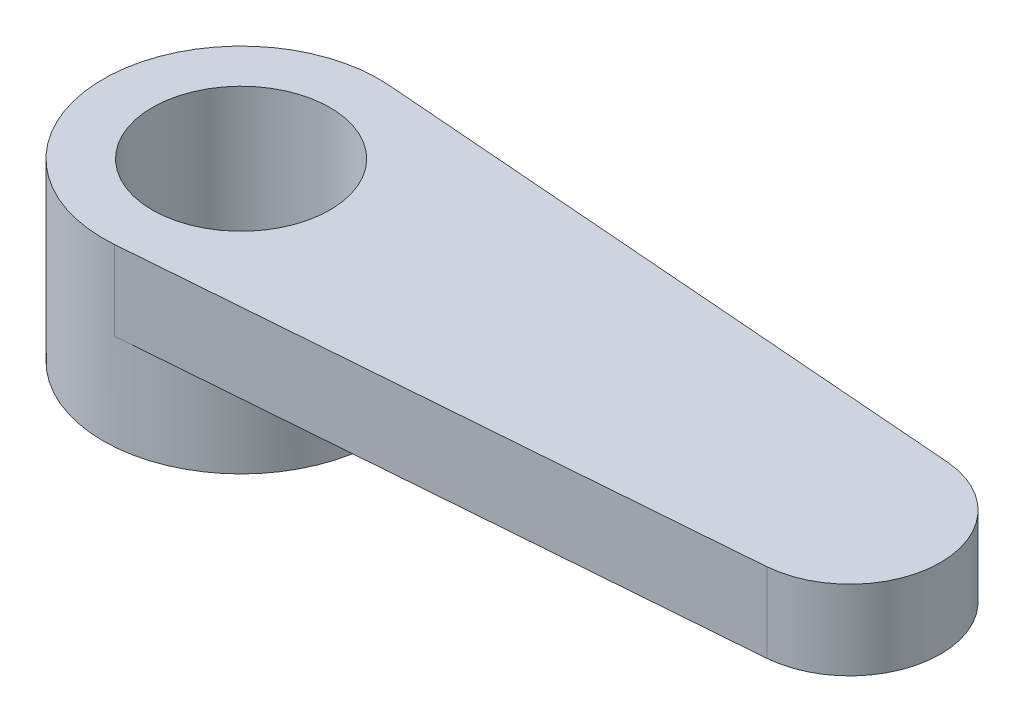
ISO-10303-21;
HEADER;
FILE_DESCRIPTION(('STEP AP214'),'2;1');
FILE_NAME('part.step','',(''),(''),'','','');
FILE_SCHEMA(('AUTOMOTIVE_DESIGN { 1 0 10303 214 1 1 1 1 }'));
ENDSEC;
DATA;
#1=APPLICATION_CONTEXT('core data for automotive mechanical design processes');
#2=APPLICATION_PROTOCOL_DEFINITION('international standard','automotive_design',2000,#1);
#3=PRODUCT_CONTEXT('',#1,'mechanical');
#4=PRODUCT('Part','Part','',(#3));
#5=PRODUCT_RELATED_PRODUCT_CATEGORY('part','',(#4));
#6=PRODUCT_DEFINITION_FORMATION('','',#4);
#7=PRODUCT_DEFINITION_CONTEXT('part definition',#1,'design');
#8=PRODUCT_DEFINITION('design','',#6,#7);
#9=PRODUCT_DEFINITION_SHAPE('','',#8);
#10=(LENGTH_UNIT() NAMED_UNIT(*) SI_UNIT(.MILLI.,.METRE.));
#11=(NAMED_UNIT(*) PLANE_ANGLE_UNIT() SI_UNIT($,.RADIAN.));
#12=(NAMED_UNIT(*) SI_UNIT($,.STERADIAN.) SOLID_ANGLE_UNIT());
#13=UNCERTAINTY_MEASURE_WITH_UNIT(LENGTH_MEASURE(1.E-05),#10,'distance_accuracy_value','');
#14=(GEOMETRIC_REPRESENTATION_CONTEXT(3) GLOBAL_UNCERTAINTY_ASSIGNED_CONTEXT((#13)) GLOBAL_UNIT_ASSIGNED_CONTEXT((#10,
#11,#12)) REPRESENTATION_CONTEXT('',''));
#15=CARTESIAN_POINT('',(0.,0.,0.));
#16=DIRECTION('',(0.,0.,1.));
#17=DIRECTION('',(1.,0.,0.));
#18=AXIS2_PLACEMENT_3D('',#15,#16,#17);
#19=CARTESIAN_POINT('',(0.,4.64,0.));
#20=DIRECTION('',(0.,-1.,0.));
#21=DIRECTION('',(0.,0.,-1.));
#22=AXIS2_PLACEMENT_3D('',#19,#20,#21);
#23=CYLINDRICAL_SURFACE('',#22,3.65);
#24=CARTESIAN_POINT('',(0.,0.,0.));
#25=DIRECTION('',(0.,1.,0.));
#26=DIRECTION('',(0.,0.,1.));
#27=AXIS2_PLACEMENT_3D('',#24,#25,#26);
#28=CIRCLE('',#27,3.65);
#29=CARTESIAN_POINT('',(0.,0.,3.65));
#30=VERTEX_POINT('',#29);
#31=EDGE_CURVE('E37',#30,#30,#28,.T.);
#32=ORIENTED_EDGE('',*,*,#31,.T.);
#33=EDGE_LOOP('',(#32));
#34=FACE_BOUND('',#33,.T.);
#35=DIRECTION('',(0.,1.,0.));
#36=VECTOR('',#35,1.);
#37=CARTESIAN_POINT('',(0.283385093167702,2.54,3.63898239745267));
#38=LINE('',#37,#36);
#39=CARTESIAN_POINT('',(0.283385093167702,2.54,3.63898239745267));
#40=VERTEX_POINT('',#39);
#41=CARTESIAN_POINT('',(0.283385093167702,4.64,3.63898239745267));
#42=VERTEX_POINT('',#41);
#43=EDGE_CURVE('E95',#40,#42,#38,.T.);
#44=ORIENTED_EDGE('',*,*,#43,.T.);
#45=CARTESIAN_POINT('',(0.,4.64,0.));
#46=DIRECTION('',(0.,1.,0.));
#47=DIRECTION('',(0.,0.,1.));
#48=AXIS2_PLACEMENT_3D('',#45,#46,#47);
#49=CIRCLE('',#48,3.65);
#50=CARTESIAN_POINT('',(0.283385093167702,4.64,-3.63898239745266));
#51=VERTEX_POINT('',#50);
#52=EDGE_CURVE('E11',#51,#42,#49,.T.);
#53=ORIENTED_EDGE('',*,*,#52,.F.);
#54=DIRECTION('',(0.,1.,0.));
#55=VECTOR('',#54,1.);
#56=CARTESIAN_POINT('',(0.283385093167702,2.54,-3.63898239745267));
#57=LINE('',#56,#55);
#58=CARTESIAN_POINT('',(0.283385093167702,2.54,-3.63898239745267));
#59=VERTEX_POINT('',#58);
#60=EDGE_CURVE('E91',#59,#51,#57,.T.);
#61=ORIENTED_EDGE('',*,*,#60,.F.);
#62=CARTESIAN_POINT('',(0.,2.54,0.));
#63=DIRECTION('',(0.,-1.,0.));
#64=DIRECTION('',(0.,0.,1.));
#65=AXIS2_PLACEMENT_3D('',#62,#63,#64);
#66=CIRCLE('',#65,3.65);
#67=EDGE_CURVE('E82',#59,#40,#66,.T.);
#68=ORIENTED_EDGE('',*,*,#67,.T.);
#69=EDGE_LOOP('',(#44,#53,#61,#68));
#70=FACE_BOUND('',#69,.T.);
#71=ADVANCED_FACE('F34',(#34,#70),#23,.T.);
#72=CARTESIAN_POINT('',(0.,4.64,0.));
#73=DIRECTION('',(0.,1.,0.));
#74=DIRECTION('',(0.,0.,1.));
#75=AXIS2_PLACEMENT_3D('',#72,#73,#74);
#76=PLANE('',#75);
#77=ORIENTED_EDGE('',*,*,#52,.T.);
#78=DIRECTION('',(0.996981478754154,0.,-0.0776397515527951));
#79=VECTOR('',#78,1.);
#80=CARTESIAN_POINT('',(0.283385093167702,4.64,3.63898239745267));
#81=LINE('',#80,#79);
#82=CARTESIAN_POINT('',(16.3037383012709,4.64,2.39140030152502));
#83=VERTEX_POINT('',#82);
#84=EDGE_CURVE('E109',#42,#83,#81,.T.);
#85=ORIENTED_EDGE('',*,*,#84,.T.);
#86=CARTESIAN_POINT('',(16.1,4.64,0.));
#87=DIRECTION('',(0.,1.,0.));
#88=DIRECTION('',(0.,0.,1.));
#89=AXIS2_PLACEMENT_3D('',#86,#87,#88);
#90=CIRCLE('',#89,2.40006347781443);
#91=CARTESIAN_POINT('',(16.3037383012709,4.64,-2.39140030152502));
#92=VERTEX_POINT('',#91);
#93=EDGE_CURVE('E113',#83,#92,#90,.T.);
#94=ORIENTED_EDGE('',*,*,#93,.T.);
#95=DIRECTION('',(-0.996981478754154,0.,-0.0776397515527951));
#96=VECTOR('',#95,1.);
#97=CARTESIAN_POINT('',(0.283385093167702,4.64,-3.63898239745267));
#98=LINE('',#97,#96);
#99=EDGE_CURVE('E47',#92,#51,#98,.T.);
#100=ORIENTED_EDGE('',*,*,#99,.T.);
#101=EDGE_LOOP('',(#77,#85,#94,#100));
#102=FACE_BOUND('',#101,.T.);
#103=CARTESIAN_POINT('',(0.,4.64,0.));
#104=DIRECTION('',(0.,1.,0.));
#105=DIRECTION('',(0.,0.,1.));
#106=AXIS2_PLACEMENT_3D('',#103,#104,#105);
#107=CIRCLE('',#106,2.35);
#108=CARTESIAN_POINT('',(0.,4.64,2.35));
#109=VERTEX_POINT('',#108);
#110=EDGE_CURVE('E101',#109,#109,#107,.T.);
#111=ORIENTED_EDGE('',*,*,#110,.F.);
#112=EDGE_LOOP('',(#111));
#113=FACE_BOUND('',#112,.T.);
#114=ADVANCED_FACE('F118',(#102,#113),#76,.T.);
#115=CARTESIAN_POINT('',(0.,0.,0.));
#116=DIRECTION('',(0.,1.,0.));
#117=DIRECTION('',(0.,0.,1.));
#118=AXIS2_PLACEMENT_3D('',#115,#116,#117);
#119=PLANE('',#118);
#120=ORIENTED_EDGE('',*,*,#31,.F.);
#121=EDGE_LOOP('',(#120));
#122=FACE_BOUND('',#121,.T.);
#123=CARTESIAN_POINT('',(0.,0.,0.));
#124=DIRECTION('',(0.,1.,0.));
#125=DIRECTION('',(0.,0.,1.));
#126=AXIS2_PLACEMENT_3D('',#123,#124,#125);
#127=CIRCLE('',#126,2.35);
#128=CARTESIAN_POINT('',(0.,0.,2.35));
#129=VERTEX_POINT('',#128);
#130=EDGE_CURVE('E104',#129,#129,#127,.T.);
#131=ORIENTED_EDGE('',*,*,#130,.T.);
#132=EDGE_LOOP('',(#131));
#133=FACE_BOUND('',#132,.T.);
#134=ADVANCED_FACE('F121',(#122,#133),#119,.F.);
#135=CARTESIAN_POINT('',(0.,4.64,0.));
#136=DIRECTION('',(0.,-1.,0.));
#137=DIRECTION('',(0.,0.,-1.));
#138=AXIS2_PLACEMENT_3D('',#135,#136,#137);
#139=CYLINDRICAL_SURFACE('',#138,2.35);
#140=ORIENTED_EDGE('',*,*,#110,.T.);
#141=EDGE_LOOP('',(#140));
#142=FACE_BOUND('',#141,.T.);
#143=ORIENTED_EDGE('',*,*,#130,.F.);
#144=EDGE_LOOP('',(#143));
#145=FACE_BOUND('',#144,.T.);
#146=ADVANCED_FACE('F125',(#142,#145),#139,.F.);
#147=CARTESIAN_POINT('',(16.1,2.54,0.));
#148=DIRECTION('',(0.,1.,0.));
#149=DIRECTION('',(0.,0.,1.));
#150=AXIS2_PLACEMENT_3D('',#147,#148,#149);
#151=CYLINDRICAL_SURFACE('',#150,2.40006347781443);
#152=ORIENTED_EDGE('',*,*,#93,.F.);
#153=DIRECTION('',(0.,1.,0.));
#154=VECTOR('',#153,1.);
#155=CARTESIAN_POINT('',(16.3037383012709,2.54,2.39140030152502));
#156=LINE('',#155,#154);
#157=CARTESIAN_POINT('',(16.3037383012709,2.54,2.39140030152502));
#158=VERTEX_POINT('',#157);
#159=EDGE_CURVE('E56',#158,#83,#156,.T.);
#160=ORIENTED_EDGE('',*,*,#159,.F.);
#161=CARTESIAN_POINT('',(16.1,2.54,0.));
#162=DIRECTION('',(0.,1.,0.));
#163=DIRECTION('',(0.,0.,1.));
#164=AXIS2_PLACEMENT_3D('',#161,#162,#163);
#165=CIRCLE('',#164,2.40006347781443);
#166=CARTESIAN_POINT('',(16.3037383012709,2.54,-2.39140030152502));
#167=VERTEX_POINT('',#166);
#168=EDGE_CURVE('E93',#158,#167,#165,.T.);
#169=ORIENTED_EDGE('',*,*,#168,.T.);
#170=DIRECTION('',(0.,1.,0.));
#171=VECTOR('',#170,1.);
#172=CARTESIAN_POINT('',(16.3037383012709,2.54,-2.39140030152502));
#173=LINE('',#172,#171);
#174=EDGE_CURVE('E76',#167,#92,#173,.T.);
#175=ORIENTED_EDGE('',*,*,#174,.T.);
#176=EDGE_LOOP('',(#152,#160,#169,#175));
#177=FACE_BOUND('',#176,.T.);
#178=ADVANCED_FACE('F116',(#177),#151,.T.);
#179=CARTESIAN_POINT('',(0.283385093167702,2.54,3.63898239745267));
#180=DIRECTION('',(0.0776397515527951,0.,0.996981478754154));
#181=DIRECTION('',(0.996981478754154,0.,-0.0776397515527951));
#182=AXIS2_PLACEMENT_3D('',#179,#180,#181);
#183=PLANE('',#182);
#184=ORIENTED_EDGE('',*,*,#84,.F.);
#185=ORIENTED_EDGE('',*,*,#43,.F.);
#186=DIRECTION('',(0.996981478754154,0.,-0.0776397515527951));
#187=VECTOR('',#186,1.);
#188=CARTESIAN_POINT('',(0.283385093167702,2.54,3.63898239745267));
#189=LINE('',#188,#187);
#190=EDGE_CURVE('E85',#40,#158,#189,.T.);
#191=ORIENTED_EDGE('',*,*,#190,.T.);
#192=ORIENTED_EDGE('',*,*,#159,.T.);
#193=EDGE_LOOP('',(#184,#185,#191,#192));
#194=FACE_BOUND('',#193,.T.);
#195=ADVANCED_FACE('F117',(#194),#183,.T.);
#196=CARTESIAN_POINT('',(0.283385093167702,2.54,-3.63898239745267));
#197=DIRECTION('',(0.0776397515527951,0.,-0.996981478754154));
#198=DIRECTION('',(-0.996981478754154,0.,-0.0776397515527951));
#199=AXIS2_PLACEMENT_3D('',#196,#197,#198);
#200=PLANE('',#199);
#201=ORIENTED_EDGE('',*,*,#99,.F.);
#202=ORIENTED_EDGE('',*,*,#174,.F.);
#203=DIRECTION('',(-0.996981478754154,0.,-0.0776397515527951));
#204=VECTOR('',#203,1.);
#205=CARTESIAN_POINT('',(0.283385093167702,2.54,-3.63898239745267));
#206=LINE('',#205,#204);
#207=EDGE_CURVE('E84',#167,#59,#206,.T.);
#208=ORIENTED_EDGE('',*,*,#207,.T.);
#209=ORIENTED_EDGE('',*,*,#60,.T.);
#210=EDGE_LOOP('',(#201,#202,#208,#209));
#211=FACE_BOUND('',#210,.T.);
#212=ADVANCED_FACE('F90',(#211),#200,.T.);
#213=CARTESIAN_POINT('',(16.1,2.54,0.));
#214=DIRECTION('',(0.,1.,0.));
#215=DIRECTION('',(0.,0.,1.));
#216=AXIS2_PLACEMENT_3D('',#213,#214,#215);
#217=PLANE('',#216);
#218=ORIENTED_EDGE('',*,*,#168,.F.);
#219=ORIENTED_EDGE('',*,*,#190,.F.);
#220=ORIENTED_EDGE('',*,*,#67,.F.);
#221=ORIENTED_EDGE('',*,*,#207,.F.);
#222=EDGE_LOOP('',(#218,#219,#220,#221));
#223=FACE_BOUND('',#222,.T.);
#224=ADVANCED_FACE('F83',(#223),#217,.F.);
#225=CLOSED_SHELL('',(#71,#114,#134,#146,#178,#195,#212,#224));
#226=MANIFOLD_SOLID_BREP('B2',#225);
#227=ADVANCED_BREP_SHAPE_REPRESENTATION('',(#18,#226),#14);
#228=SHAPE_DEFINITION_REPRESENTATION(#9,#227);
ENDSEC;
END-ISO-10303-21;
